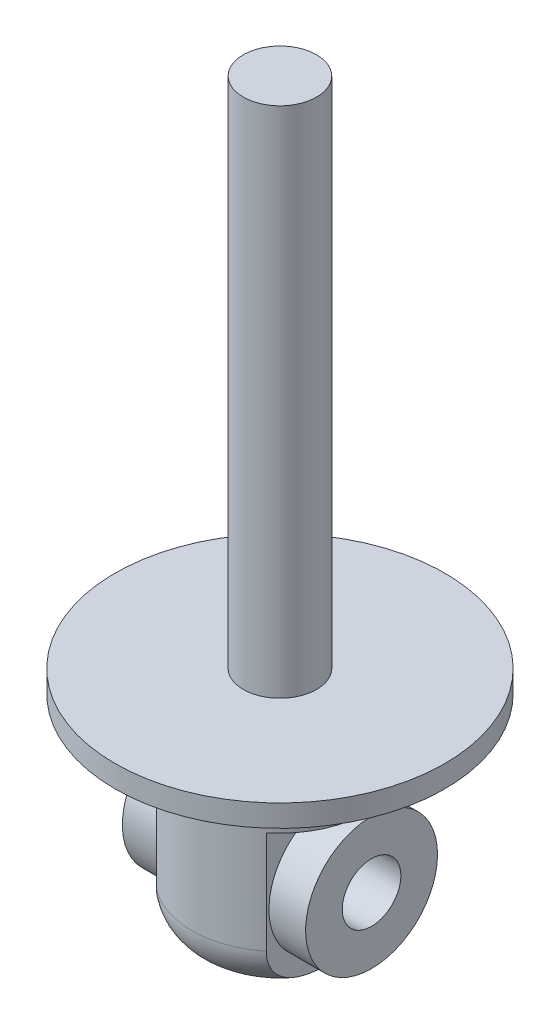
ISO-10303-21;
HEADER;
FILE_DESCRIPTION(('STEP AP214'),'2;1');
FILE_NAME('part.step','',(''),(''),'','','');
FILE_SCHEMA(('AUTOMOTIVE_DESIGN { 1 0 10303 214 1 1 1 1 }'));
ENDSEC;
DATA;
#1=APPLICATION_CONTEXT('core data for automotive mechanical design processes');
#2=APPLICATION_PROTOCOL_DEFINITION('international standard','automotive_design',2000,#1);
#3=PRODUCT_CONTEXT('',#1,'mechanical');
#4=PRODUCT('Part','Part','',(#3));
#5=PRODUCT_RELATED_PRODUCT_CATEGORY('part','',(#4));
#6=PRODUCT_DEFINITION_FORMATION('','',#4);
#7=PRODUCT_DEFINITION_CONTEXT('part definition',#1,'design');
#8=PRODUCT_DEFINITION('design','',#6,#7);
#9=PRODUCT_DEFINITION_SHAPE('','',#8);
#10=(LENGTH_UNIT() NAMED_UNIT(*) SI_UNIT(.MILLI.,.METRE.));
#11=(NAMED_UNIT(*) PLANE_ANGLE_UNIT() SI_UNIT($,.RADIAN.));
#12=(NAMED_UNIT(*) SI_UNIT($,.STERADIAN.) SOLID_ANGLE_UNIT());
#13=UNCERTAINTY_MEASURE_WITH_UNIT(LENGTH_MEASURE(1.E-05),#10,'distance_accuracy_value','');
#14=(GEOMETRIC_REPRESENTATION_CONTEXT(3) GLOBAL_UNCERTAINTY_ASSIGNED_CONTEXT((#13)) GLOBAL_UNIT_ASSIGNED_CONTEXT((#10,
#11,#12)) REPRESENTATION_CONTEXT('',''));
#15=CARTESIAN_POINT('',(0.,0.,0.));
#16=DIRECTION('',(0.,0.,1.));
#17=DIRECTION('',(1.,0.,0.));
#18=AXIS2_PLACEMENT_3D('',#15,#16,#17);
#19=CARTESIAN_POINT('',(0.,3.,0.));
#20=DIRECTION('',(0.,-1.,0.));
#21=DIRECTION('',(0.,0.,-1.));
#22=AXIS2_PLACEMENT_3D('',#19,#20,#21);
#23=CYLINDRICAL_SURFACE('',#22,22.5);
#24=CARTESIAN_POINT('',(0.,3.,0.));
#25=DIRECTION('',(0.,1.,0.));
#26=DIRECTION('',(0.,0.,1.));
#27=AXIS2_PLACEMENT_3D('',#24,#25,#26);
#28=CIRCLE('',#27,22.5);
#29=CARTESIAN_POINT('',(0.,3.,22.5));
#30=VERTEX_POINT('',#29);
#31=EDGE_CURVE('E144',#30,#30,#28,.T.);
#32=ORIENTED_EDGE('',*,*,#31,.F.);
#33=EDGE_LOOP('',(#32));
#34=FACE_BOUND('',#33,.T.);
#35=CARTESIAN_POINT('',(0.,0.,0.));
#36=DIRECTION('',(0.,1.,0.));
#37=DIRECTION('',(0.,0.,1.));
#38=AXIS2_PLACEMENT_3D('',#35,#36,#37);
#39=CIRCLE('',#38,22.5);
#40=CARTESIAN_POINT('',(0.,0.,22.5));
#41=VERTEX_POINT('',#40);
#42=EDGE_CURVE('E141',#41,#41,#39,.T.);
#43=ORIENTED_EDGE('',*,*,#42,.T.);
#44=EDGE_LOOP('',(#43));
#45=FACE_BOUND('',#44,.T.);
#46=ADVANCED_FACE('F41',(#34,#45),#23,.T.);
#47=CARTESIAN_POINT('',(0.,3.,0.));
#48=DIRECTION('',(0.,1.,0.));
#49=DIRECTION('',(0.,0.,1.));
#50=AXIS2_PLACEMENT_3D('',#47,#48,#49);
#51=PLANE('',#50);
#52=CARTESIAN_POINT('',(0.,3.,0.));
#53=DIRECTION('',(0.,1.,0.));
#54=DIRECTION('',(0.,0.,1.));
#55=AXIS2_PLACEMENT_3D('',#52,#53,#54);
#56=CIRCLE('',#55,5.);
#57=CARTESIAN_POINT('',(0.,3.,5.));
#58=VERTEX_POINT('',#57);
#59=EDGE_CURVE('E138',#58,#58,#56,.T.);
#60=ORIENTED_EDGE('',*,*,#59,.F.);
#61=EDGE_LOOP('',(#60));
#62=FACE_BOUND('',#61,.T.);
#63=ORIENTED_EDGE('',*,*,#31,.T.);
#64=EDGE_LOOP('',(#63));
#65=FACE_BOUND('',#64,.T.);
#66=ADVANCED_FACE('F202',(#62,#65),#51,.T.);
#67=CARTESIAN_POINT('',(0.,0.,0.));
#68=DIRECTION('',(0.,1.,0.));
#69=DIRECTION('',(0.,0.,1.));
#70=AXIS2_PLACEMENT_3D('',#67,#68,#69);
#71=PLANE('',#70);
#72=CARTESIAN_POINT('',(0.,0.,0.));
#73=DIRECTION('',(0.,-1.,0.));
#74=DIRECTION('',(0.,0.,-1.));
#75=AXIS2_PLACEMENT_3D('',#72,#73,#74);
#76=CIRCLE('',#75,12.);
#77=CARTESIAN_POINT('',(0.,0.,-12.));
#78=VERTEX_POINT('',#77);
#79=EDGE_CURVE('E134',#78,#78,#76,.T.);
#80=ORIENTED_EDGE('',*,*,#79,.F.);
#81=EDGE_LOOP('',(#80));
#82=FACE_BOUND('',#81,.T.);
#83=ORIENTED_EDGE('',*,*,#42,.F.);
#84=EDGE_LOOP('',(#83));
#85=FACE_BOUND('',#84,.T.);
#86=ADVANCED_FACE('F200',(#82,#85),#71,.F.);
#87=CARTESIAN_POINT('',(0.,73.,0.));
#88=DIRECTION('',(0.,-1.,0.));
#89=DIRECTION('',(0.,0.,-1.));
#90=AXIS2_PLACEMENT_3D('',#87,#88,#89);
#91=CYLINDRICAL_SURFACE('',#90,5.);
#92=CARTESIAN_POINT('',(0.,73.,0.));
#93=DIRECTION('',(0.,1.,0.));
#94=DIRECTION('',(0.,0.,1.));
#95=AXIS2_PLACEMENT_3D('',#92,#93,#94);
#96=CIRCLE('',#95,5.);
#97=CARTESIAN_POINT('',(0.,73.,5.));
#98=VERTEX_POINT('',#97);
#99=EDGE_CURVE('E133',#98,#98,#96,.T.);
#100=ORIENTED_EDGE('',*,*,#99,.F.);
#101=EDGE_LOOP('',(#100));
#102=FACE_BOUND('',#101,.T.);
#103=ORIENTED_EDGE('',*,*,#59,.T.);
#104=EDGE_LOOP('',(#103));
#105=FACE_BOUND('',#104,.T.);
#106=ADVANCED_FACE('F196',(#102,#105),#91,.T.);
#107=CARTESIAN_POINT('',(0.,73.,0.));
#108=DIRECTION('',(0.,1.,0.));
#109=DIRECTION('',(0.,0.,1.));
#110=AXIS2_PLACEMENT_3D('',#107,#108,#109);
#111=PLANE('',#110);
#112=ORIENTED_EDGE('',*,*,#99,.T.);
#113=EDGE_LOOP('',(#112));
#114=FACE_BOUND('',#113,.T.);
#115=ADVANCED_FACE('F192',(#114),#111,.T.);
#116=CARTESIAN_POINT('',(0.,-28.,0.));
#117=DIRECTION('',(0.,1.,0.));
#118=DIRECTION('',(0.,0.,1.));
#119=AXIS2_PLACEMENT_3D('',#116,#117,#118);
#120=CYLINDRICAL_SURFACE('',#119,12.);
#121=DIRECTION('',(0.,1.,0.));
#122=VECTOR('',#121,1.);
#123=CARTESIAN_POINT('',(7.5,-28.,-9.3674969975976));
#124=LINE('',#123,#122);
#125=CARTESIAN_POINT('',(7.5,-8.,-9.3674969975976));
#126=VERTEX_POINT('',#125);
#127=CARTESIAN_POINT('',(7.5,-22.,-9.3674969975976));
#128=VERTEX_POINT('',#127);
#129=EDGE_CURVE('E128',#126,#128,#124,.F.);
#130=ORIENTED_EDGE('',*,*,#129,.T.);
#131=CARTESIAN_POINT('',(0.,-22.,0.));
#132=DIRECTION('',(0.,-1.,0.));
#133=DIRECTION('',(0.,0.,-1.));
#134=AXIS2_PLACEMENT_3D('',#131,#132,#133);
#135=CIRCLE('',#134,12.);
#136=CARTESIAN_POINT('',(-7.5,-22.,-9.3674969975976));
#137=VERTEX_POINT('',#136);
#138=EDGE_CURVE('E157',#128,#137,#135,.F.);
#139=ORIENTED_EDGE('',*,*,#138,.T.);
#140=DIRECTION('',(0.,1.,0.));
#141=VECTOR('',#140,1.);
#142=CARTESIAN_POINT('',(-7.5,-28.,-9.3674969975976));
#143=LINE('',#142,#141);
#144=CARTESIAN_POINT('',(-7.5,-8.,-9.36749699759761));
#145=VERTEX_POINT('',#144);
#146=EDGE_CURVE('E126',#137,#145,#143,.T.);
#147=ORIENTED_EDGE('',*,*,#146,.T.);
#148=CARTESIAN_POINT('',(0.,-8.,0.));
#149=DIRECTION('',(0.,1.,0.));
#150=DIRECTION('',(-1.,0.,0.));
#151=AXIS2_PLACEMENT_3D('',#148,#149,#150);
#152=CIRCLE('',#151,12.);
#153=CARTESIAN_POINT('',(-7.5,-8.,9.36749699759759));
#154=VERTEX_POINT('',#153);
#155=EDGE_CURVE('E137',#145,#154,#152,.T.);
#156=ORIENTED_EDGE('',*,*,#155,.T.);
#157=DIRECTION('',(0.,1.,0.));
#158=VECTOR('',#157,1.);
#159=CARTESIAN_POINT('',(-7.5,-28.,9.3674969975976));
#160=LINE('',#159,#158);
#161=CARTESIAN_POINT('',(-7.5,-22.,9.3674969975976));
#162=VERTEX_POINT('',#161);
#163=EDGE_CURVE('E122',#154,#162,#160,.F.);
#164=ORIENTED_EDGE('',*,*,#163,.T.);
#165=CARTESIAN_POINT('',(0.,-22.,0.));
#166=DIRECTION('',(0.,-1.,0.));
#167=DIRECTION('',(0.,0.,-1.));
#168=AXIS2_PLACEMENT_3D('',#165,#166,#167);
#169=CIRCLE('',#168,12.);
#170=CARTESIAN_POINT('',(7.5,-22.,9.3674969975976));
#171=VERTEX_POINT('',#170);
#172=EDGE_CURVE('E155',#162,#171,#169,.F.);
#173=ORIENTED_EDGE('',*,*,#172,.T.);
#174=DIRECTION('',(0.,1.,0.));
#175=VECTOR('',#174,1.);
#176=CARTESIAN_POINT('',(7.5,-28.,9.3674969975976));
#177=LINE('',#176,#175);
#178=CARTESIAN_POINT('',(7.5,-8.,9.3674969975976));
#179=VERTEX_POINT('',#178);
#180=EDGE_CURVE('E131',#171,#179,#177,.T.);
#181=ORIENTED_EDGE('',*,*,#180,.T.);
#182=CARTESIAN_POINT('',(0.,-8.,0.));
#183=DIRECTION('',(0.,1.,0.));
#184=DIRECTION('',(-1.,0.,0.));
#185=AXIS2_PLACEMENT_3D('',#182,#183,#184);
#186=CIRCLE('',#185,12.);
#187=EDGE_CURVE('E151',#179,#126,#186,.T.);
#188=ORIENTED_EDGE('',*,*,#187,.T.);
#189=EDGE_LOOP('',(#130,#139,#147,#156,#164,#173,#181,#188));
#190=FACE_BOUND('',#189,.T.);
#191=ORIENTED_EDGE('',*,*,#79,.T.);
#192=EDGE_LOOP('',(#191));
#193=FACE_BOUND('',#192,.T.);
#194=ADVANCED_FACE('F188',(#190,#193),#120,.T.);
#195=CARTESIAN_POINT('',(0.,-28.,0.));
#196=DIRECTION('',(0.,-1.,0.));
#197=DIRECTION('',(0.,0.,-1.));
#198=AXIS2_PLACEMENT_3D('',#195,#196,#197);
#199=PLANE('',#198);
#200=CARTESIAN_POINT('',(0.,-28.,0.));
#201=DIRECTION('',(0.,-1.,0.));
#202=DIRECTION('',(0.,0.,-1.));
#203=AXIS2_PLACEMENT_3D('',#200,#201,#202);
#204=CIRCLE('',#203,6.);
#205=CARTESIAN_POINT('',(3.75,-28.,4.6837484987988));
#206=VERTEX_POINT('',#205);
#207=EDGE_CURVE('E64',#206,#206,#204,.T.);
#208=ORIENTED_EDGE('',*,*,#207,.T.);
#209=EDGE_LOOP('',(#208));
#210=FACE_BOUND('',#209,.T.);
#211=ADVANCED_FACE('F184',(#210),#199,.T.);
#212=CARTESIAN_POINT('',(-19.5267527584545,-8.00000000000001,-22.5));
#213=DIRECTION('',(0.,1.,0.));
#214=DIRECTION('',(-1.,0.,0.));
#215=AXIS2_PLACEMENT_3D('',#212,#213,#214);
#216=PLANE('',#215);
#217=DIRECTION('',(0.,0.,1.));
#218=VECTOR('',#217,1.);
#219=CARTESIAN_POINT('',(-7.5,-8.,-22.5));
#220=LINE('',#219,#218);
#221=EDGE_CURVE('E114',#145,#154,#220,.T.);
#222=ORIENTED_EDGE('',*,*,#221,.T.);
#223=ORIENTED_EDGE('',*,*,#155,.F.);
#224=EDGE_LOOP('',(#222,#223));
#225=FACE_BOUND('',#224,.T.);
#226=ADVANCED_FACE('F177',(#225),#216,.F.);
#227=CARTESIAN_POINT('',(-7.5,-8.,-22.5));
#228=DIRECTION('',(1.,0.,0.));
#229=DIRECTION('',(0.,1.,0.));
#230=AXIS2_PLACEMENT_3D('',#227,#228,#229);
#231=PLANE('',#230);
#232=CARTESIAN_POINT('',(-7.5,-17.2346713108085,0.));
#233=DIRECTION('',(1.,0.,0.));
#234=DIRECTION('',(0.,1.,0.));
#235=AXIS2_PLACEMENT_3D('',#232,#233,#234);
#236=CIRCLE('',#235,9.);
#237=CARTESIAN_POINT('',(-7.5,-8.23467131080854,0.));
#238=VERTEX_POINT('',#237);
#239=EDGE_CURVE('E11',#238,#238,#236,.F.);
#240=ORIENTED_EDGE('',*,*,#239,.F.);
#241=EDGE_LOOP('',(#240));
#242=FACE_BOUND('',#241,.T.);
#243=ORIENTED_EDGE('',*,*,#146,.F.);
#244=CARTESIAN_POINT('',(-7.5,-22.,-9.3674969975976));
#245=CARTESIAN_POINT('',(-7.5,-22.1379254143059,-9.36752360059267));
#246=CARTESIAN_POINT('',(-7.5,-22.2758424222538,-9.36140588132895));
#247=CARTESIAN_POINT('',(-7.5,-22.5505676857078,-9.33707750908817));
#248=CARTESIAN_POINT('',(-7.5,-22.6873762447252,-9.31887028805672));
#249=CARTESIAN_POINT('',(-7.5,-22.9582958989928,-9.27066095936277));
#250=CARTESIAN_POINT('',(-7.5,-23.0924159795805,-9.24070924828961));
#251=CARTESIAN_POINT('',(-7.5,-23.3575801147512,-9.16937352993057));
#252=CARTESIAN_POINT('',(-7.5,-23.4886240777116,-9.12798918258977));
#253=CARTESIAN_POINT('',(-7.5,-23.7466218974493,-9.03430487150778));
#254=CARTESIAN_POINT('',(-7.5,-23.8735790263913,-8.98201390451625));
#255=CARTESIAN_POINT('',(-7.5,-24.1227575790591,-8.86705796606133));
#256=CARTESIAN_POINT('',(-7.5,-24.2449771650718,-8.80438901766089));
#257=CARTESIAN_POINT('',(-7.5,-24.4839677800717,-8.66933878563604));
#258=CARTESIAN_POINT('',(-7.5,-24.600737116334,-8.59695451134742));
#259=CARTESIAN_POINT('',(-7.5,-24.8282482220368,-8.44319282951406));
#260=CARTESIAN_POINT('',(-7.5,-24.9389877104532,-8.36181205348802));
#261=CARTESIAN_POINT('',(-7.5,-25.1579144130164,-8.18768644331856));
#262=CARTESIAN_POINT('',(-7.5,-25.2658555332673,-8.09463252078577));
#263=CARTESIAN_POINT('',(-7.5,-25.4743801064196,-7.90055757070905));
#264=CARTESIAN_POINT('',(-7.5,-25.5749606927938,-7.79953347070882));
#265=CARTESIAN_POINT('',(-7.5,-25.768458381235,-7.59046393768999));
#266=CARTESIAN_POINT('',(-7.5,-25.8613778166993,-7.48242066059875));
#267=CARTESIAN_POINT('',(-7.5,-26.0394979506358,-7.26013736029205));
#268=CARTESIAN_POINT('',(-7.5,-26.1246970340121,-7.14589604840397));
#269=CARTESIAN_POINT('',(-7.5,-26.3256362712251,-6.85704779298534));
#270=CARTESIAN_POINT('',(-7.5,-26.4369025152764,-6.67931225038141));
#271=CARTESIAN_POINT('',(-7.5,-26.6432108740015,-6.31464931098994));
#272=CARTESIAN_POINT('',(-7.5,-26.7382459212892,-6.12771795555987));
#273=CARTESIAN_POINT('',(-7.5,-26.9130471129313,-5.74657647010742));
#274=CARTESIAN_POINT('',(-7.5,-26.99279227796,-5.55235677020163));
#275=CARTESIAN_POINT('',(-7.5,-27.1380510940922,-5.15863799998372));
#276=CARTESIAN_POINT('',(-7.5,-27.2035584278337,-4.95913663004319));
#277=CARTESIAN_POINT('',(-7.5,-27.3908164358595,-4.32075222258564));
#278=CARTESIAN_POINT('',(-7.5,-27.4887372819532,-3.87479994139773));
#279=CARTESIAN_POINT('',(-7.5,-27.601795145913,-3.20050262834446));
#280=CARTESIAN_POINT('',(-7.5,-27.6338614838101,-2.97457486110677));
#281=CARTESIAN_POINT('',(-7.5,-27.6885816818793,-2.52154005301274));
#282=CARTESIAN_POINT('',(-7.5,-27.7112354408725,-2.29443299950643));
#283=CARTESIAN_POINT('',(-7.5,-27.7489045691448,-1.83798099757031));
#284=CARTESIAN_POINT('',(-7.5,-27.7638639879165,-1.6086316811448));
#285=CARTESIAN_POINT('',(-7.5,-27.7872324676842,-1.14960500392803));
#286=CARTESIAN_POINT('',(-7.5,-27.7956415162603,-0.91992764251561));
#287=CARTESIAN_POINT('',(-7.5,-27.8067543378702,-0.460642803314461));
#288=CARTESIAN_POINT('',(-7.5,-27.8094631033358,-0.231035440618714));
#289=CARTESIAN_POINT('',(-7.5,-27.8094868649699,0.228175345708415));
#290=CARTESIAN_POINT('',(-7.5,-27.8068020072903,0.457778769277948));
#291=CARTESIAN_POINT('',(-7.5,-27.7971062576963,0.860052623868412));
#292=CARTESIAN_POINT('',(-7.5,-27.7913301453297,1.03275311870077));
#293=CARTESIAN_POINT('',(-7.5,-27.7762110534871,1.37800275867868));
#294=CARTESIAN_POINT('',(-7.5,-27.7668680335314,1.5505519020843));
#295=CARTESIAN_POINT('',(-7.5,-27.7441214761805,1.89544436590636));
#296=CARTESIAN_POINT('',(-7.5,-27.7307166483849,2.06778760341439));
#297=CARTESIAN_POINT('',(-7.5,-27.6992148675028,2.41204706848752));
#298=CARTESIAN_POINT('',(-7.5,-27.6811177628437,2.58396328207749));
#299=CARTESIAN_POINT('',(-7.5,-27.6189958920543,3.09635640433831));
#300=CARTESIAN_POINT('',(-7.5,-27.5669984248249,3.43593213480135));
#301=CARTESIAN_POINT('',(-7.5,-27.4351423357508,4.10959237490321));
#302=CARTESIAN_POINT('',(-7.5,-27.355308453961,4.44368148569127));
#303=CARTESIAN_POINT('',(-7.5,-27.2038111026621,4.95715365621199));
#304=CARTESIAN_POINT('',(-7.5,-27.1439609353749,5.14003433340763));
#305=CARTESIAN_POINT('',(-7.5,-27.0123631623895,5.50143954937346));
#306=CARTESIAN_POINT('',(-7.5,-26.9406194722125,5.67996549966769));
#307=CARTESIAN_POINT('',(-7.5,-26.7842432272727,6.0314620533266));
#308=CARTESIAN_POINT('',(-7.5,-26.6996016483107,6.20442866360549));
#309=CARTESIAN_POINT('',(-7.5,-26.5167498210721,6.54305361307534));
#310=CARTESIAN_POINT('',(-7.5,-26.4185416742757,6.70871307891992));
#311=CARTESIAN_POINT('',(-7.5,-26.2240529923947,7.00649966399646));
#312=CARTESIAN_POINT('',(-7.5,-26.1297317797446,7.13990631715523));
#313=CARTESIAN_POINT('',(-7.5,-25.9309296052284,7.39890898180223));
#314=CARTESIAN_POINT('',(-7.5,-25.8264508014865,7.52450664316448));
#315=CARTESIAN_POINT('',(-7.5,-25.607436067938,7.76661841824938));
#316=CARTESIAN_POINT('',(-7.5,-25.4929006463323,7.88313299041554));
#317=CARTESIAN_POINT('',(-7.5,-25.2541619190981,8.10569786476809));
#318=CARTESIAN_POINT('',(-7.5,-25.1299635767238,8.21175347643237));
#319=CARTESIAN_POINT('',(-7.5,-24.8713303527546,8.41298289122939));
#320=CARTESIAN_POINT('',(-7.5,-24.7368179353904,8.50805731823179));
#321=CARTESIAN_POINT('',(-7.5,-24.4593220739095,8.68496347378572));
#322=CARTESIAN_POINT('',(-7.5,-24.3163383126342,8.7667947060969));
#323=CARTESIAN_POINT('',(-7.5,-24.0230929544392,8.91594215373419));
#324=CARTESIAN_POINT('',(-7.5,-23.8728361201283,8.9832677144264));
#325=CARTESIAN_POINT('',(-7.5,-23.5662968472034,9.10239902811024));
#326=CARTESIAN_POINT('',(-7.5,-23.4100154370938,9.15420741703698));
#327=CARTESIAN_POINT('',(-7.5,-23.1150060704322,9.2353925939809));
#328=CARTESIAN_POINT('',(-7.5,-22.9768570994337,9.26688619930669));
#329=CARTESIAN_POINT('',(-7.5,-22.6983015916913,9.31735123041742));
#330=CARTESIAN_POINT('',(-7.5,-22.5578953958111,9.33632452903322));
#331=CARTESIAN_POINT('',(-7.5,-22.275429325193,9.36154435583975));
#332=CARTESIAN_POINT('',(-7.5,-22.1333652921735,9.36774432315377));
#333=CARTESIAN_POINT('',(-7.5,-21.8492117208226,9.3672334735671));
#334=CARTESIAN_POINT('',(-7.5,-21.7071221908008,9.36051816632472));
#335=CARTESIAN_POINT('',(-7.5,-21.5656316807606,9.34732049649696));
#336=B_SPLINE_CURVE_WITH_KNOTS('',3,(#244,#245,#246,#247,#248,#249,#250,#251,#252,#253,#254,
#255,#256,#257,#258,#259,#260,#261,#262,#263,#264,#265,#266,#267,#268,#269,#270,#271,#272,#273,
#274,#275,#276,#277,#278,#279,#280,#281,#282,#283,#284,#285,#286,#287,#288,#289,#290,#291,#292,
#293,#294,#295,#296,#297,#298,#299,#300,#301,#302,#303,#304,#305,#306,#307,#308,#309,#310,#311,
#312,#313,#314,#315,#316,#317,#318,#319,#320,#321,#322,#323,#324,#325,#326,#327,#328,#329,#330,
#331,#332,#333,#334,#335),.UNSPECIFIED.,.F.,.F.,(4,2,2,2,2,2,2,2,2,2,2,2,2,2,2,2,2,2,2,2,2,2,2,
2,2,2,2,2,2,2,2,2,2,2,2,2,2,2,2,2,2,2,2,2,2,4),(0.,0.413627663637871,0.827137957584398,
1.23889292798153,1.65066014703029,2.06208903774946,2.47367595816892,2.88538986902966,
3.29725845980313,3.72436838766617,4.15164377603436,4.57878854240068,5.00602246204601,
5.63412300795969,6.26249634795658,6.89172580704452,7.52123388945459,8.88701692596542,
9.57151018255495,10.2560107967953,10.945420883386,11.6348322771307,12.3236396176771,
13.0124282937461,13.5307878437428,14.049153276633,14.5676835625985,15.0862306005159,
16.1159608613781,17.1447782561444,17.7217048491637,18.2984418853475,18.8755843128165,
19.4526374401617,19.9423239016047,20.4319065486455,20.9214644693518,21.4107725732877,
21.9042096245419,22.3976651612681,22.8908018293294,23.3838546796382,23.8083845635045,
24.2328509303164,24.6588618282394,25.0850208670553),.UNSPECIFIED.);
#337=EDGE_CURVE('E160',#137,#162,#336,.T.);
#338=ORIENTED_EDGE('',*,*,#337,.T.);
#339=ORIENTED_EDGE('',*,*,#163,.F.);
#340=ORIENTED_EDGE('',*,*,#221,.F.);
#341=EDGE_LOOP('',(#243,#338,#339,#340));
#342=FACE_BOUND('',#341,.T.);
#343=ADVANCED_FACE('F172',(#242,#342),#231,.F.);
#344=CARTESIAN_POINT('',(19.5267527584545,-8.,-22.5));
#345=DIRECTION('',(0.,1.,0.));
#346=DIRECTION('',(-1.,0.,0.));
#347=AXIS2_PLACEMENT_3D('',#344,#345,#346);
#348=PLANE('',#347);
#349=DIRECTION('',(0.,0.,1.));
#350=VECTOR('',#349,1.);
#351=CARTESIAN_POINT('',(7.5,-8.,-22.5));
#352=LINE('',#351,#350);
#353=EDGE_CURVE('E117',#126,#179,#352,.T.);
#354=ORIENTED_EDGE('',*,*,#353,.F.);
#355=ORIENTED_EDGE('',*,*,#187,.F.);
#356=EDGE_LOOP('',(#354,#355));
#357=FACE_BOUND('',#356,.T.);
#358=ADVANCED_FACE('F176',(#357),#348,.F.);
#359=CARTESIAN_POINT('',(7.5,-8.,-22.5));
#360=DIRECTION('',(-1.,0.,0.));
#361=DIRECTION('',(0.,-1.,0.));
#362=AXIS2_PLACEMENT_3D('',#359,#360,#361);
#363=PLANE('',#362);
#364=CARTESIAN_POINT('',(7.5,-17.2346713108085,0.));
#365=DIRECTION('',(-1.,0.,0.));
#366=DIRECTION('',(0.,-1.,0.));
#367=AXIS2_PLACEMENT_3D('',#364,#365,#366);
#368=CIRCLE('',#367,9.);
#369=CARTESIAN_POINT('',(7.5,-26.2346713108085,0.));
#370=VERTEX_POINT('',#369);
#371=EDGE_CURVE('E46',#370,#370,#368,.F.);
#372=ORIENTED_EDGE('',*,*,#371,.F.);
#373=EDGE_LOOP('',(#372));
#374=FACE_BOUND('',#373,.T.);
#375=ORIENTED_EDGE('',*,*,#180,.F.);
#376=CARTESIAN_POINT('',(7.5,-22.,9.3674969975976));
#377=CARTESIAN_POINT('',(7.5,-22.1379254143059,9.36752360059266));
#378=CARTESIAN_POINT('',(7.5,-22.2758424222538,9.36140588132894));
#379=CARTESIAN_POINT('',(7.5,-22.5505676857078,9.33707750908816));
#380=CARTESIAN_POINT('',(7.5,-22.6873762447252,9.31887028805672));
#381=CARTESIAN_POINT('',(7.5,-22.9582958989928,9.27066095936276));
#382=CARTESIAN_POINT('',(7.5,-23.0924159795805,9.24070924828961));
#383=CARTESIAN_POINT('',(7.5,-23.3575801147512,9.16937352993056));
#384=CARTESIAN_POINT('',(7.5,-23.4886240777116,9.12798918258977));
#385=CARTESIAN_POINT('',(7.5,-23.7466218974493,9.03430487150778));
#386=CARTESIAN_POINT('',(7.5,-23.8735790263913,8.98201390451624));
#387=CARTESIAN_POINT('',(7.5,-24.1227575790591,8.86705796606132));
#388=CARTESIAN_POINT('',(7.5,-24.2449771650718,8.80438901766088));
#389=CARTESIAN_POINT('',(7.5,-24.4839677800717,8.66933878563604));
#390=CARTESIAN_POINT('',(7.5,-24.600737116334,8.59695451134742));
#391=CARTESIAN_POINT('',(7.5,-24.8282482220368,8.44319282951405));
#392=CARTESIAN_POINT('',(7.5,-24.9389877104532,8.36181205348801));
#393=CARTESIAN_POINT('',(7.5,-25.1579144130164,8.18768644331855));
#394=CARTESIAN_POINT('',(7.5,-25.2658555332673,8.09463252078576));
#395=CARTESIAN_POINT('',(7.5,-25.4743801064196,7.90055757070904));
#396=CARTESIAN_POINT('',(7.5,-25.5749606927938,7.79953347070881));
#397=CARTESIAN_POINT('',(7.5,-25.768458381235,7.59046393768998));
#398=CARTESIAN_POINT('',(7.5,-25.8613778166993,7.48242066059874));
#399=CARTESIAN_POINT('',(7.5,-26.0394979506358,7.26013736029205));
#400=CARTESIAN_POINT('',(7.5,-26.1246970340121,7.14589604840397));
#401=CARTESIAN_POINT('',(7.5,-26.3256362712251,6.85704779298534));
#402=CARTESIAN_POINT('',(7.5,-26.4369025152764,6.67931225038141));
#403=CARTESIAN_POINT('',(7.5,-26.6432108740015,6.31464931098994));
#404=CARTESIAN_POINT('',(7.5,-26.7382459212892,6.12771795555987));
#405=CARTESIAN_POINT('',(7.5,-26.9130471129313,5.74657647010742));
#406=CARTESIAN_POINT('',(7.5,-26.99279227796,5.55235677020163));
#407=CARTESIAN_POINT('',(7.5,-27.1380510940922,5.15863799998372));
#408=CARTESIAN_POINT('',(7.5,-27.2035584278337,4.95913663004319));
#409=CARTESIAN_POINT('',(7.5,-27.3908164358595,4.32075222258564));
#410=CARTESIAN_POINT('',(7.5,-27.4887372819532,3.87479994139773));
#411=CARTESIAN_POINT('',(7.5,-27.601795145913,3.20050262834446));
#412=CARTESIAN_POINT('',(7.5,-27.6338614838101,2.97457486110677));
#413=CARTESIAN_POINT('',(7.5,-27.6885816818793,2.52154005301274));
#414=CARTESIAN_POINT('',(7.5,-27.7112354408725,2.29443299950643));
#415=CARTESIAN_POINT('',(7.5,-27.7489045691448,1.83798099757031));
#416=CARTESIAN_POINT('',(7.5,-27.7638639879165,1.6086316811448));
#417=CARTESIAN_POINT('',(7.5,-27.7872324676842,1.14960500392803));
#418=CARTESIAN_POINT('',(7.5,-27.7956415162603,0.919927642515611));
#419=CARTESIAN_POINT('',(7.5,-27.8067543378702,0.460642803314463));
#420=CARTESIAN_POINT('',(7.5,-27.8094631033358,0.231035440618717));
#421=CARTESIAN_POINT('',(7.5,-27.8094868649699,-0.228175345708411));
#422=CARTESIAN_POINT('',(7.5,-27.8068020072903,-0.457778769277943));
#423=CARTESIAN_POINT('',(7.5,-27.7971062576963,-0.860052623868407));
#424=CARTESIAN_POINT('',(7.5,-27.7913301453297,-1.03275311870077));
#425=CARTESIAN_POINT('',(7.5,-27.7762110534871,-1.37800275867867));
#426=CARTESIAN_POINT('',(7.5,-27.7668680335314,-1.5505519020843));
#427=CARTESIAN_POINT('',(7.5,-27.7441214761805,-1.89544436590636));
#428=CARTESIAN_POINT('',(7.5,-27.7307166483849,-2.06778760341439));
#429=CARTESIAN_POINT('',(7.5,-27.6992148675028,-2.41204706848751));
#430=CARTESIAN_POINT('',(7.5,-27.6811177628437,-2.58396328207749));
#431=CARTESIAN_POINT('',(7.5,-27.6189958920543,-3.09635640433831));
#432=CARTESIAN_POINT('',(7.5,-27.5669984248249,-3.43593213480135));
#433=CARTESIAN_POINT('',(7.5,-27.4351423357508,-4.10959237490321));
#434=CARTESIAN_POINT('',(7.5,-27.355308453961,-4.44368148569127));
#435=CARTESIAN_POINT('',(7.5,-27.2038111026621,-4.95715365621199));
#436=CARTESIAN_POINT('',(7.5,-27.1439609353749,-5.14003433340763));
#437=CARTESIAN_POINT('',(7.5,-27.0123631623895,-5.50143954937346));
#438=CARTESIAN_POINT('',(7.5,-26.9406194722125,-5.67996549966768));
#439=CARTESIAN_POINT('',(7.5,-26.7842432272727,-6.0314620533266));
#440=CARTESIAN_POINT('',(7.5,-26.6996016483107,-6.20442866360548));
#441=CARTESIAN_POINT('',(7.5,-26.5167498210721,-6.54305361307534));
#442=CARTESIAN_POINT('',(7.5,-26.4185416742757,-6.70871307891992));
#443=CARTESIAN_POINT('',(7.5,-26.2240529923947,-7.00649966399646));
#444=CARTESIAN_POINT('',(7.5,-26.1297317797446,-7.13990631715523));
#445=CARTESIAN_POINT('',(7.5,-25.9309296052284,-7.39890898180223));
#446=CARTESIAN_POINT('',(7.5,-25.8264508014865,-7.52450664316449));
#447=CARTESIAN_POINT('',(7.5,-25.607436067938,-7.76661841824938));
#448=CARTESIAN_POINT('',(7.5,-25.4929006463323,-7.88313299041554));
#449=CARTESIAN_POINT('',(7.5,-25.2541619190981,-8.10569786476809));
#450=CARTESIAN_POINT('',(7.5,-25.1299635767238,-8.21175347643237));
#451=CARTESIAN_POINT('',(7.5,-24.8713303527546,-8.41298289122939));
#452=CARTESIAN_POINT('',(7.5,-24.7368179353904,-8.50805731823179));
#453=CARTESIAN_POINT('',(7.5,-24.4593220739095,-8.68496347378572));
#454=CARTESIAN_POINT('',(7.5,-24.3163383126342,-8.7667947060969));
#455=CARTESIAN_POINT('',(7.5,-24.0230929544391,-8.91594215373419));
#456=CARTESIAN_POINT('',(7.5,-23.8728361201283,-8.98326771442639));
#457=CARTESIAN_POINT('',(7.5,-23.5662968472034,-9.10239902811023));
#458=CARTESIAN_POINT('',(7.5,-23.4100154370938,-9.15420741703697));
#459=CARTESIAN_POINT('',(7.5,-23.1150060704322,-9.2353925939809));
#460=CARTESIAN_POINT('',(7.5,-22.9768570994337,-9.26688619930668));
#461=CARTESIAN_POINT('',(7.5,-22.6983015916913,-9.31735123041741));
#462=CARTESIAN_POINT('',(7.5,-22.5578953958111,-9.33632452903322));
#463=CARTESIAN_POINT('',(7.5,-22.275429325193,-9.36154435583975));
#464=CARTESIAN_POINT('',(7.5,-22.1333652921735,-9.36774432315377));
#465=CARTESIAN_POINT('',(7.5,-21.8492117208226,-9.36723347356709));
#466=CARTESIAN_POINT('',(7.5,-21.7071221908008,-9.36051816632472));
#467=CARTESIAN_POINT('',(7.5,-21.5656316807606,-9.34732049649695));
#468=B_SPLINE_CURVE_WITH_KNOTS('',3,(#376,#377,#378,#379,#380,#381,#382,#383,#384,#385,#386,
#387,#388,#389,#390,#391,#392,#393,#394,#395,#396,#397,#398,#399,#400,#401,#402,#403,#404,#405,
#406,#407,#408,#409,#410,#411,#412,#413,#414,#415,#416,#417,#418,#419,#420,#421,#422,#423,#424,
#425,#426,#427,#428,#429,#430,#431,#432,#433,#434,#435,#436,#437,#438,#439,#440,#441,#442,#443,
#444,#445,#446,#447,#448,#449,#450,#451,#452,#453,#454,#455,#456,#457,#458,#459,#460,#461,#462,
#463,#464,#465,#466,#467),.UNSPECIFIED.,.F.,.F.,(4,2,2,2,2,2,2,2,2,2,2,2,2,2,2,2,2,2,2,2,2,2,2,
2,2,2,2,2,2,2,2,2,2,2,2,2,2,2,2,2,2,2,2,2,2,4),(0.,0.413627663637871,0.827137957584398,
1.23889292798153,1.65066014703029,2.06208903774946,2.47367595816892,2.88538986902965,
3.29725845980313,3.72436838766617,4.15164377603436,4.57878854240068,5.006022462046,
5.63412300795969,6.26249634795658,6.89172580704451,7.52123388945458,8.88701692596541,
9.57151018255494,10.2560107967953,10.945420883386,11.6348322771307,12.3236396176771,
13.0124282937461,13.5307878437428,14.049153276633,14.5676835625985,15.0862306005159,
16.1159608613781,17.1447782561444,17.7217048491637,18.2984418853475,18.8755843128165,
19.4526374401617,19.9423239016047,20.4319065486455,20.9214644693518,21.4107725732877,
21.9042096245419,22.397665161268,22.8908018293294,23.3838546796382,23.8083845635045,
24.2328509303164,24.6588618282393,25.0850208670553),.UNSPECIFIED.);
#469=EDGE_CURVE('E105',#171,#128,#468,.T.);
#470=ORIENTED_EDGE('',*,*,#469,.T.);
#471=ORIENTED_EDGE('',*,*,#129,.F.);
#472=ORIENTED_EDGE('',*,*,#353,.T.);
#473=EDGE_LOOP('',(#375,#470,#471,#472));
#474=FACE_BOUND('',#473,.T.);
#475=ADVANCED_FACE('F179',(#374,#474),#363,.F.);
#476=CARTESIAN_POINT('',(0.,-22.,0.));
#477=DIRECTION('',(0.,-1.,0.));
#478=DIRECTION('',(0.,0.,-1.));
#479=AXIS2_PLACEMENT_3D('',#476,#477,#478);
#480=TOROIDAL_SURFACE('',#479,6.,6.);
#481=ORIENTED_EDGE('',*,*,#337,.F.);
#482=ORIENTED_EDGE('',*,*,#138,.F.);
#483=ORIENTED_EDGE('',*,*,#469,.F.);
#484=ORIENTED_EDGE('',*,*,#172,.F.);
#485=EDGE_LOOP('',(#481,#482,#483,#484));
#486=FACE_BOUND('',#485,.T.);
#487=ORIENTED_EDGE('',*,*,#207,.F.);
#488=EDGE_LOOP('',(#487));
#489=FACE_BOUND('',#488,.T.);
#490=ADVANCED_FACE('F43',(#486,#489),#480,.T.);
#491=CARTESIAN_POINT('',(12.5,-17.2346713108085,0.));
#492=DIRECTION('',(-1.,0.,0.));
#493=DIRECTION('',(0.,0.,1.));
#494=AXIS2_PLACEMENT_3D('',#491,#492,#493);
#495=CYLINDRICAL_SURFACE('',#494,9.);
#496=CARTESIAN_POINT('',(-12.5,-17.2346713108085,0.));
#497=DIRECTION('',(1.,0.,0.));
#498=DIRECTION('',(0.,0.,-1.));
#499=AXIS2_PLACEMENT_3D('',#496,#497,#498);
#500=CIRCLE('',#499,9.);
#501=CARTESIAN_POINT('',(-12.5,-17.2346713108085,-9.));
#502=VERTEX_POINT('',#501);
#503=EDGE_CURVE('E412',#502,#502,#500,.T.);
#504=ORIENTED_EDGE('',*,*,#503,.T.);
#505=EDGE_LOOP('',(#504));
#506=FACE_BOUND('',#505,.T.);
#507=ORIENTED_EDGE('',*,*,#239,.T.);
#508=EDGE_LOOP('',(#507));
#509=FACE_BOUND('',#508,.T.);
#510=ADVANCED_FACE('F269',(#506,#509),#495,.T.);
#511=CARTESIAN_POINT('',(12.5,-17.2346713108085,0.));
#512=DIRECTION('',(1.,0.,0.));
#513=DIRECTION('',(0.,0.,-1.));
#514=AXIS2_PLACEMENT_3D('',#511,#512,#513);
#515=CIRCLE('',#514,9.);
#516=CARTESIAN_POINT('',(12.5,-17.2346713108085,-9.));
#517=VERTEX_POINT('',#516);
#518=EDGE_CURVE('E409',#517,#517,#515,.T.);
#519=ORIENTED_EDGE('',*,*,#518,.F.);
#520=EDGE_LOOP('',(#519));
#521=FACE_BOUND('',#520,.T.);
#522=ORIENTED_EDGE('',*,*,#371,.T.);
#523=EDGE_LOOP('',(#522));
#524=FACE_BOUND('',#523,.T.);
#525=ADVANCED_FACE('F275',(#521,#524),#495,.T.);
#526=CARTESIAN_POINT('',(12.5,-17.2346713108085,0.));
#527=DIRECTION('',(-1.,0.,0.));
#528=DIRECTION('',(0.,0.,1.));
#529=AXIS2_PLACEMENT_3D('',#526,#527,#528);
#530=CYLINDRICAL_SURFACE('',#529,4.);
#531=CARTESIAN_POINT('',(-12.5,-17.2346713108085,0.));
#532=DIRECTION('',(1.,0.,0.));
#533=DIRECTION('',(0.,0.,-1.));
#534=AXIS2_PLACEMENT_3D('',#531,#532,#533);
#535=CIRCLE('',#534,4.);
#536=CARTESIAN_POINT('',(-12.5,-17.2346713108085,-4.));
#537=VERTEX_POINT('',#536);
#538=EDGE_CURVE('E418',#537,#537,#535,.T.);
#539=ORIENTED_EDGE('',*,*,#538,.F.);
#540=EDGE_LOOP('',(#539));
#541=FACE_BOUND('',#540,.T.);
#542=CARTESIAN_POINT('',(12.5,-17.2346713108085,0.));
#543=DIRECTION('',(1.,0.,0.));
#544=DIRECTION('',(0.,0.,-1.));
#545=AXIS2_PLACEMENT_3D('',#542,#543,#544);
#546=CIRCLE('',#545,4.);
#547=CARTESIAN_POINT('',(12.5,-17.2346713108085,-4.));
#548=VERTEX_POINT('',#547);
#549=EDGE_CURVE('E416',#548,#548,#546,.T.);
#550=ORIENTED_EDGE('',*,*,#549,.T.);
#551=EDGE_LOOP('',(#550));
#552=FACE_BOUND('',#551,.T.);
#553=DIRECTION('',(-1.,0.,0.));
#554=VECTOR('',#553,1.);
#555=CARTESIAN_POINT('',(0.,-17.6173356554043,3.98165392762544));
#556=LINE('',#555,#554);
#557=CARTESIAN_POINT('',(7.5,-17.6173356554043,3.98165392762544));
#558=VERTEX_POINT('',#557);
#559=CARTESIAN_POINT('',(-7.5,-17.6173356554043,3.98165392762544));
#560=VERTEX_POINT('',#559);
#561=EDGE_CURVE('E104',#558,#560,#556,.T.);
#562=ORIENTED_EDGE('',*,*,#561,.F.);
#563=CARTESIAN_POINT('',(7.5,-17.2346713108085,0.));
#564=DIRECTION('',(-1.,0.,0.));
#565=DIRECTION('',(0.,-1.,0.));
#566=AXIS2_PLACEMENT_3D('',#563,#564,#565);
#567=CIRCLE('',#566,4.);
#568=CARTESIAN_POINT('',(7.5,-17.6173356554043,-3.98165392762545));
#569=VERTEX_POINT('',#568);
#570=EDGE_CURVE('E58',#569,#558,#567,.F.);
#571=ORIENTED_EDGE('',*,*,#570,.F.);
#572=DIRECTION('',(-1.,0.,0.));
#573=VECTOR('',#572,1.);
#574=CARTESIAN_POINT('',(0.,-17.6173356554043,-3.98165392762544));
#575=LINE('',#574,#573);
#576=CARTESIAN_POINT('',(-7.5,-17.6173356554043,-3.98165392762544));
#577=VERTEX_POINT('',#576);
#578=EDGE_CURVE('E95',#577,#569,#575,.F.);
#579=ORIENTED_EDGE('',*,*,#578,.F.);
#580=CARTESIAN_POINT('',(-7.5,-17.2346713108085,0.));
#581=DIRECTION('',(1.,0.,0.));
#582=DIRECTION('',(0.,1.,0.));
#583=AXIS2_PLACEMENT_3D('',#580,#581,#582);
#584=CIRCLE('',#583,4.);
#585=EDGE_CURVE('E98',#560,#577,#584,.F.);
#586=ORIENTED_EDGE('',*,*,#585,.F.);
#587=EDGE_LOOP('',(#562,#571,#579,#586));
#588=FACE_BOUND('',#587,.T.);
#589=ADVANCED_FACE('F97',(#541,#552,#588),#530,.F.);
#590=CARTESIAN_POINT('',(12.5,-17.2346713108085,0.));
#591=DIRECTION('',(1.,0.,0.));
#592=DIRECTION('',(0.,0.,-1.));
#593=AXIS2_PLACEMENT_3D('',#590,#591,#592);
#594=PLANE('',#593);
#595=ORIENTED_EDGE('',*,*,#518,.T.);
#596=EDGE_LOOP('',(#595));
#597=FACE_BOUND('',#596,.T.);
#598=ORIENTED_EDGE('',*,*,#549,.F.);
#599=EDGE_LOOP('',(#598));
#600=FACE_BOUND('',#599,.T.);
#601=ADVANCED_FACE('F289',(#597,#600),#594,.T.);
#602=CARTESIAN_POINT('',(-12.5,-17.2346713108085,0.));
#603=DIRECTION('',(1.,0.,0.));
#604=DIRECTION('',(0.,0.,-1.));
#605=AXIS2_PLACEMENT_3D('',#602,#603,#604);
#606=PLANE('',#605);
#607=ORIENTED_EDGE('',*,*,#503,.F.);
#608=EDGE_LOOP('',(#607));
#609=FACE_BOUND('',#608,.T.);
#610=ORIENTED_EDGE('',*,*,#538,.T.);
#611=EDGE_LOOP('',(#610));
#612=FACE_BOUND('',#611,.T.);
#613=ADVANCED_FACE('F297',(#609,#612),#606,.F.);
#614=CARTESIAN_POINT('',(-22.5,-18.,0.));
#615=DIRECTION('',(1.,0.,0.));
#616=DIRECTION('',(0.,1.,0.));
#617=AXIS2_PLACEMENT_3D('',#614,#615,#616);
#618=CYLINDRICAL_SURFACE('',#617,4.);
#619=CARTESIAN_POINT('',(7.5,-18.,0.));
#620=DIRECTION('',(1.,0.,0.));
#621=DIRECTION('',(0.,1.,0.));
#622=AXIS2_PLACEMENT_3D('',#619,#620,#621);
#623=CIRCLE('',#622,4.);
#624=EDGE_CURVE('E111',#569,#558,#623,.T.);
#625=ORIENTED_EDGE('',*,*,#624,.T.);
#626=ORIENTED_EDGE('',*,*,#561,.T.);
#627=CARTESIAN_POINT('',(-7.5,-18.,0.));
#628=DIRECTION('',(1.,0.,0.));
#629=DIRECTION('',(0.,1.,0.));
#630=AXIS2_PLACEMENT_3D('',#627,#628,#629);
#631=CIRCLE('',#630,4.);
#632=EDGE_CURVE('E110',#577,#560,#631,.T.);
#633=ORIENTED_EDGE('',*,*,#632,.F.);
#634=ORIENTED_EDGE('',*,*,#578,.T.);
#635=EDGE_LOOP('',(#625,#626,#633,#634));
#636=FACE_BOUND('',#635,.T.);
#637=ADVANCED_FACE('F113',(#636),#618,.F.);
#638=ORIENTED_EDGE('',*,*,#624,.F.);
#639=ORIENTED_EDGE('',*,*,#570,.T.);
#640=EDGE_LOOP('',(#638,#639));
#641=FACE_BOUND('',#640,.T.);
#642=ADVANCED_FACE('F263',(#641),#363,.F.);
#643=ORIENTED_EDGE('',*,*,#632,.T.);
#644=ORIENTED_EDGE('',*,*,#585,.T.);
#645=EDGE_LOOP('',(#643,#644));
#646=FACE_BOUND('',#645,.T.);
#647=ADVANCED_FACE('F109',(#646),#231,.F.);
#648=CLOSED_SHELL('',(#46,#66,#86,#106,#115,#194,#211,#226,#343,#358,#475,#490,#510,#525,#589,
#601,#613,#637,#642,#647));
#649=MANIFOLD_SOLID_BREP('B2',#648);
#650=ADVANCED_BREP_SHAPE_REPRESENTATION('',(#18,#649),#14);
#651=SHAPE_DEFINITION_REPRESENTATION(#9,#650);
ENDSEC;
END-ISO-10303-21;
